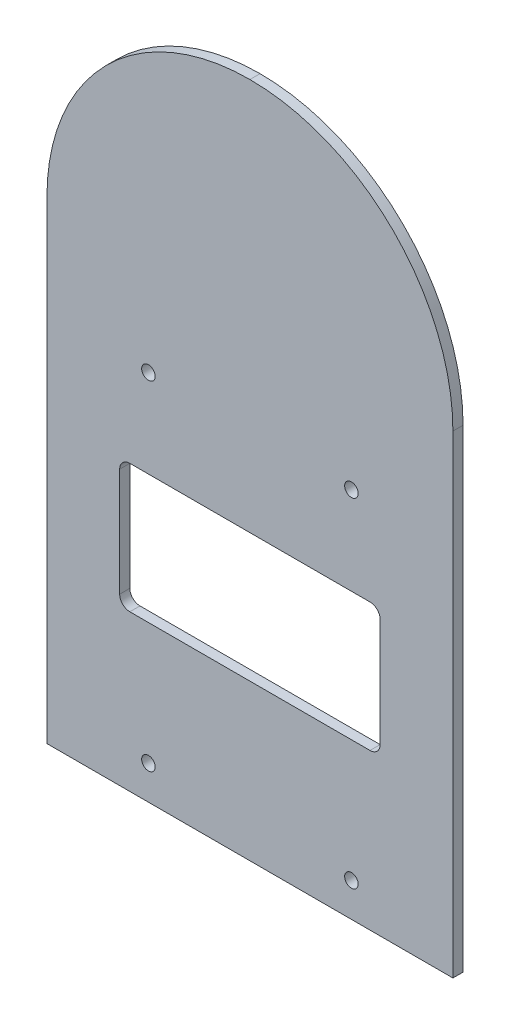
ISO-10303-21;
HEADER;
FILE_DESCRIPTION(('STEP AP214'),'2;1');
FILE_NAME('part.step','',(''),(''),'','','');
FILE_SCHEMA(('AUTOMOTIVE_DESIGN { 1 0 10303 214 1 1 1 1 }'));
ENDSEC;
DATA;
#1=APPLICATION_CONTEXT('core data for automotive mechanical design processes');
#2=APPLICATION_PROTOCOL_DEFINITION('international standard','automotive_design',2000,#1);
#3=PRODUCT_CONTEXT('',#1,'mechanical');
#4=PRODUCT('Part','Part','',(#3));
#5=PRODUCT_RELATED_PRODUCT_CATEGORY('part','',(#4));
#6=PRODUCT_DEFINITION_FORMATION('','',#4);
#7=PRODUCT_DEFINITION_CONTEXT('part definition',#1,'design');
#8=PRODUCT_DEFINITION('design','',#6,#7);
#9=PRODUCT_DEFINITION_SHAPE('','',#8);
#10=(LENGTH_UNIT() NAMED_UNIT(*) SI_UNIT(.MILLI.,.METRE.));
#11=(NAMED_UNIT(*) PLANE_ANGLE_UNIT() SI_UNIT($,.RADIAN.));
#12=(NAMED_UNIT(*) SI_UNIT($,.STERADIAN.) SOLID_ANGLE_UNIT());
#13=UNCERTAINTY_MEASURE_WITH_UNIT(LENGTH_MEASURE(1.E-05),#10,'distance_accuracy_value','');
#14=(GEOMETRIC_REPRESENTATION_CONTEXT(3) GLOBAL_UNCERTAINTY_ASSIGNED_CONTEXT((#13)) GLOBAL_UNIT_ASSIGNED_CONTEXT((#10,
#11,#12)) REPRESENTATION_CONTEXT('',''));
#15=CARTESIAN_POINT('',(0.,0.,0.));
#16=DIRECTION('',(0.,0.,1.));
#17=DIRECTION('',(1.,0.,0.));
#18=AXIS2_PLACEMENT_3D('',#15,#16,#17);
#19=CARTESIAN_POINT('',(-60.,-100.,3.));
#20=DIRECTION('',(1.,0.,0.));
#21=DIRECTION('',(0.,0.,-1.));
#22=AXIS2_PLACEMENT_3D('',#19,#20,#21);
#23=PLANE('',#22);
#24=DIRECTION('',(0.,-1.,0.));
#25=VECTOR('',#24,1.);
#26=CARTESIAN_POINT('',(-60.,-100.,3.));
#27=LINE('',#26,#25);
#28=CARTESIAN_POINT('',(-60.,40.,3.));
#29=VERTEX_POINT('',#28);
#30=CARTESIAN_POINT('',(-60.,-100.,3.));
#31=VERTEX_POINT('',#30);
#32=EDGE_CURVE('E202',#29,#31,#27,.T.);
#33=ORIENTED_EDGE('',*,*,#32,.F.);
#34=DIRECTION('',(0.,0.,-1.));
#35=VECTOR('',#34,1.);
#36=CARTESIAN_POINT('',(-60.,40.,3.));
#37=LINE('',#36,#35);
#38=CARTESIAN_POINT('',(-60.,40.,0.));
#39=VERTEX_POINT('',#38);
#40=EDGE_CURVE('E11',#29,#39,#37,.T.);
#41=ORIENTED_EDGE('',*,*,#40,.T.);
#42=DIRECTION('',(0.,-1.,0.));
#43=VECTOR('',#42,1.);
#44=CARTESIAN_POINT('',(-60.,-100.,0.));
#45=LINE('',#44,#43);
#46=CARTESIAN_POINT('',(-60.,-100.,0.));
#47=VERTEX_POINT('',#46);
#48=EDGE_CURVE('E211',#39,#47,#45,.T.);
#49=ORIENTED_EDGE('',*,*,#48,.T.);
#50=DIRECTION('',(0.,0.,-1.));
#51=VECTOR('',#50,1.);
#52=CARTESIAN_POINT('',(-60.,-100.,3.));
#53=LINE('',#52,#51);
#54=EDGE_CURVE('E219',#31,#47,#53,.T.);
#55=ORIENTED_EDGE('',*,*,#54,.F.);
#56=EDGE_LOOP('',(#33,#41,#49,#55));
#57=FACE_BOUND('',#56,.T.);
#58=ADVANCED_FACE('F34',(#57),#23,.F.);
#59=CARTESIAN_POINT('',(60.,-99.9999999999999,3.));
#60=DIRECTION('',(0.,1.,0.));
#61=DIRECTION('',(-1.,0.,0.));
#62=AXIS2_PLACEMENT_3D('',#59,#60,#61);
#63=PLANE('',#62);
#64=DIRECTION('',(1.,0.,0.));
#65=VECTOR('',#64,1.);
#66=CARTESIAN_POINT('',(60.,-99.9999999999999,0.));
#67=LINE('',#66,#65);
#68=CARTESIAN_POINT('',(60.,-99.9999999999999,0.));
#69=VERTEX_POINT('',#68);
#70=EDGE_CURVE('E213',#47,#69,#67,.T.);
#71=ORIENTED_EDGE('',*,*,#70,.T.);
#72=DIRECTION('',(0.,0.,-1.));
#73=VECTOR('',#72,1.);
#74=CARTESIAN_POINT('',(60.,-99.9999999999999,3.));
#75=LINE('',#74,#73);
#76=CARTESIAN_POINT('',(60.,-99.9999999999999,3.));
#77=VERTEX_POINT('',#76);
#78=EDGE_CURVE('E210',#77,#69,#75,.T.);
#79=ORIENTED_EDGE('',*,*,#78,.F.);
#80=DIRECTION('',(1.,0.,0.));
#81=VECTOR('',#80,1.);
#82=CARTESIAN_POINT('',(60.,-99.9999999999999,3.));
#83=LINE('',#82,#81);
#84=EDGE_CURVE('E204',#31,#77,#83,.T.);
#85=ORIENTED_EDGE('',*,*,#84,.F.);
#86=ORIENTED_EDGE('',*,*,#54,.T.);
#87=EDGE_LOOP('',(#71,#79,#85,#86));
#88=FACE_BOUND('',#87,.T.);
#89=ADVANCED_FACE('F261',(#88),#63,.F.);
#90=CARTESIAN_POINT('',(60.,-99.9999999999999,3.));
#91=DIRECTION('',(-1.,0.,0.));
#92=DIRECTION('',(0.,0.,1.));
#93=AXIS2_PLACEMENT_3D('',#90,#91,#92);
#94=PLANE('',#93);
#95=DIRECTION('',(0.,1.,0.));
#96=VECTOR('',#95,1.);
#97=CARTESIAN_POINT('',(60.,-99.9999999999999,0.));
#98=LINE('',#97,#96);
#99=CARTESIAN_POINT('',(60.,40.0000000000001,0.));
#100=VERTEX_POINT('',#99);
#101=EDGE_CURVE('E205',#69,#100,#98,.T.);
#102=ORIENTED_EDGE('',*,*,#101,.T.);
#103=DIRECTION('',(0.,0.,-1.));
#104=VECTOR('',#103,1.);
#105=CARTESIAN_POINT('',(60.,40.0000000000001,3.));
#106=LINE('',#105,#104);
#107=CARTESIAN_POINT('',(60.,40.0000000000001,3.));
#108=VERTEX_POINT('',#107);
#109=EDGE_CURVE('E226',#100,#108,#106,.F.);
#110=ORIENTED_EDGE('',*,*,#109,.T.);
#111=DIRECTION('',(0.,1.,0.));
#112=VECTOR('',#111,1.);
#113=CARTESIAN_POINT('',(60.,-99.9999999999999,3.));
#114=LINE('',#113,#112);
#115=EDGE_CURVE('E207',#77,#108,#114,.T.);
#116=ORIENTED_EDGE('',*,*,#115,.F.);
#117=ORIENTED_EDGE('',*,*,#78,.T.);
#118=EDGE_LOOP('',(#102,#110,#116,#117));
#119=FACE_BOUND('',#118,.T.);
#120=ADVANCED_FACE('F267',(#119),#94,.F.);
#121=CARTESIAN_POINT('',(0.,0.,3.));
#122=DIRECTION('',(0.,0.,1.));
#123=DIRECTION('',(1.,0.,0.));
#124=AXIS2_PLACEMENT_3D('',#121,#122,#123);
#125=PLANE('',#124);
#126=CARTESIAN_POINT('',(30.,-90.,3.));
#127=DIRECTION('',(0.,0.,1.));
#128=DIRECTION('',(-1.,0.,0.));
#129=AXIS2_PLACEMENT_3D('',#126,#127,#128);
#130=CIRCLE('',#129,2.);
#131=CARTESIAN_POINT('',(28.,-90.,3.));
#132=VERTEX_POINT('',#131);
#133=EDGE_CURVE('E373',#132,#132,#130,.T.);
#134=ORIENTED_EDGE('',*,*,#133,.F.);
#135=EDGE_LOOP('',(#134));
#136=FACE_BOUND('',#135,.T.);
#137=CARTESIAN_POINT('',(30.,10.,3.));
#138=DIRECTION('',(0.,0.,1.));
#139=DIRECTION('',(-1.,0.,0.));
#140=AXIS2_PLACEMENT_3D('',#137,#138,#139);
#141=CIRCLE('',#140,2.);
#142=CARTESIAN_POINT('',(28.,10.,3.));
#143=VERTEX_POINT('',#142);
#144=EDGE_CURVE('E369',#143,#143,#141,.T.);
#145=ORIENTED_EDGE('',*,*,#144,.F.);
#146=EDGE_LOOP('',(#145));
#147=FACE_BOUND('',#146,.T.);
#148=CARTESIAN_POINT('',(-30.,10.,3.));
#149=DIRECTION('',(0.,0.,1.));
#150=DIRECTION('',(1.,0.,0.));
#151=AXIS2_PLACEMENT_3D('',#148,#149,#150);
#152=CIRCLE('',#151,2.);
#153=CARTESIAN_POINT('',(-28.,10.,3.));
#154=VERTEX_POINT('',#153);
#155=EDGE_CURVE('E362',#154,#154,#152,.T.);
#156=ORIENTED_EDGE('',*,*,#155,.F.);
#157=EDGE_LOOP('',(#156));
#158=FACE_BOUND('',#157,.T.);
#159=CARTESIAN_POINT('',(-30.,-90.,3.));
#160=DIRECTION('',(0.,0.,1.));
#161=DIRECTION('',(1.,0.,0.));
#162=AXIS2_PLACEMENT_3D('',#159,#160,#161);
#163=CIRCLE('',#162,2.);
#164=CARTESIAN_POINT('',(-28.,-90.,3.));
#165=VERTEX_POINT('',#164);
#166=EDGE_CURVE('E155',#165,#165,#163,.T.);
#167=ORIENTED_EDGE('',*,*,#166,.F.);
#168=EDGE_LOOP('',(#167));
#169=FACE_BOUND('',#168,.T.);
#170=CARTESIAN_POINT('',(-35.4999999999946,-51.0000000000016,3.));
#171=DIRECTION('',(0.,0.,1.));
#172=DIRECTION('',(1.,0.,0.));
#173=AXIS2_PLACEMENT_3D('',#170,#171,#172);
#174=CIRCLE('',#173,3.00000000000001);
#175=CARTESIAN_POINT('',(-38.4999999999946,-51.0000000000016,3.));
#176=VERTEX_POINT('',#175);
#177=CARTESIAN_POINT('',(-35.4999999999946,-54.0000000000016,3.));
#178=VERTEX_POINT('',#177);
#179=EDGE_CURVE('E51',#176,#178,#174,.T.);
#180=ORIENTED_EDGE('',*,*,#179,.F.);
#181=DIRECTION('',(0.,-1.,0.));
#182=VECTOR('',#181,1.);
#183=CARTESIAN_POINT('',(-38.4999999999946,-19.0000000000016,3.));
#184=LINE('',#183,#182);
#185=CARTESIAN_POINT('',(-38.4999999999946,-19.0000000000016,3.));
#186=VERTEX_POINT('',#185);
#187=EDGE_CURVE('E149',#186,#176,#184,.T.);
#188=ORIENTED_EDGE('',*,*,#187,.F.);
#189=CARTESIAN_POINT('',(-35.4999999999946,-19.0000000000016,3.));
#190=DIRECTION('',(0.,0.,1.));
#191=DIRECTION('',(-1.,0.,0.));
#192=AXIS2_PLACEMENT_3D('',#189,#190,#191);
#193=CIRCLE('',#192,3.);
#194=CARTESIAN_POINT('',(-35.4999999999946,-16.0000000000016,3.));
#195=VERTEX_POINT('',#194);
#196=EDGE_CURVE('E152',#195,#186,#193,.T.);
#197=ORIENTED_EDGE('',*,*,#196,.F.);
#198=DIRECTION('',(-1.,0.,0.));
#199=VECTOR('',#198,1.);
#200=CARTESIAN_POINT('',(-35.4999999999946,-16.0000000000016,3.));
#201=LINE('',#200,#199);
#202=CARTESIAN_POINT('',(35.5000000000054,-16.0000000000016,3.));
#203=VERTEX_POINT('',#202);
#204=EDGE_CURVE('E183',#203,#195,#201,.T.);
#205=ORIENTED_EDGE('',*,*,#204,.F.);
#206=CARTESIAN_POINT('',(35.5000000000054,-19.0000000000016,3.));
#207=DIRECTION('',(0.,0.,1.));
#208=DIRECTION('',(1.,0.,0.));
#209=AXIS2_PLACEMENT_3D('',#206,#207,#208);
#210=CIRCLE('',#209,3.);
#211=CARTESIAN_POINT('',(38.5000000000054,-19.0000000000016,3.));
#212=VERTEX_POINT('',#211);
#213=EDGE_CURVE('E180',#212,#203,#210,.T.);
#214=ORIENTED_EDGE('',*,*,#213,.F.);
#215=DIRECTION('',(0.,1.,0.));
#216=VECTOR('',#215,1.);
#217=CARTESIAN_POINT('',(38.5000000000054,-19.0000000000016,3.));
#218=LINE('',#217,#216);
#219=CARTESIAN_POINT('',(38.5000000000054,-51.0000000000016,3.));
#220=VERTEX_POINT('',#219);
#221=EDGE_CURVE('E177',#220,#212,#218,.T.);
#222=ORIENTED_EDGE('',*,*,#221,.F.);
#223=CARTESIAN_POINT('',(35.5000000000054,-51.0000000000016,3.));
#224=DIRECTION('',(0.,0.,1.));
#225=DIRECTION('',(1.,0.,0.));
#226=AXIS2_PLACEMENT_3D('',#223,#224,#225);
#227=CIRCLE('',#226,3.);
#228=CARTESIAN_POINT('',(35.5000000000054,-54.0000000000016,3.));
#229=VERTEX_POINT('',#228);
#230=EDGE_CURVE('E174',#229,#220,#227,.T.);
#231=ORIENTED_EDGE('',*,*,#230,.F.);
#232=DIRECTION('',(1.,0.,0.));
#233=VECTOR('',#232,1.);
#234=CARTESIAN_POINT('',(-35.4999999999946,-54.0000000000016,3.));
#235=LINE('',#234,#233);
#236=EDGE_CURVE('E172',#178,#229,#235,.T.);
#237=ORIENTED_EDGE('',*,*,#236,.F.);
#238=EDGE_LOOP('',(#180,#188,#197,#205,#214,#222,#231,#237));
#239=FACE_BOUND('',#238,.T.);
#240=ORIENTED_EDGE('',*,*,#115,.T.);
#241=CARTESIAN_POINT('',(0.,40.0000000000001,3.));
#242=DIRECTION('',(0.,0.,1.));
#243=DIRECTION('',(1.,0.,0.));
#244=AXIS2_PLACEMENT_3D('',#241,#242,#243);
#245=CIRCLE('',#244,60.);
#246=CARTESIAN_POINT('',(0.,100.,3.));
#247=VERTEX_POINT('',#246);
#248=EDGE_CURVE('E43',#108,#247,#245,.T.);
#249=ORIENTED_EDGE('',*,*,#248,.T.);
#250=CARTESIAN_POINT('',(0.,40.,3.));
#251=DIRECTION('',(0.,0.,1.));
#252=DIRECTION('',(1.,0.,0.));
#253=AXIS2_PLACEMENT_3D('',#250,#251,#252);
#254=CIRCLE('',#253,60.);
#255=EDGE_CURVE('E229',#247,#29,#254,.T.);
#256=ORIENTED_EDGE('',*,*,#255,.T.);
#257=ORIENTED_EDGE('',*,*,#32,.T.);
#258=ORIENTED_EDGE('',*,*,#84,.T.);
#259=EDGE_LOOP('',(#240,#249,#256,#257,#258));
#260=FACE_BOUND('',#259,.T.);
#261=ADVANCED_FACE('F290',(#136,#147,#158,#169,#239,#260),#125,.T.);
#262=CARTESIAN_POINT('',(0.,0.,0.));
#263=DIRECTION('',(0.,0.,1.));
#264=DIRECTION('',(1.,0.,0.));
#265=AXIS2_PLACEMENT_3D('',#262,#263,#264);
#266=PLANE('',#265);
#267=CARTESIAN_POINT('',(30.,-90.,0.));
#268=DIRECTION('',(0.,0.,1.));
#269=DIRECTION('',(1.,0.,0.));
#270=AXIS2_PLACEMENT_3D('',#267,#268,#269);
#271=CIRCLE('',#270,2.);
#272=CARTESIAN_POINT('',(32.,-90.,0.));
#273=VERTEX_POINT('',#272);
#274=EDGE_CURVE('E38',#273,#273,#271,.T.);
#275=ORIENTED_EDGE('',*,*,#274,.T.);
#276=EDGE_LOOP('',(#275));
#277=FACE_BOUND('',#276,.T.);
#278=CARTESIAN_POINT('',(30.,10.,0.));
#279=DIRECTION('',(0.,0.,1.));
#280=DIRECTION('',(1.,0.,0.));
#281=AXIS2_PLACEMENT_3D('',#278,#279,#280);
#282=CIRCLE('',#281,2.);
#283=CARTESIAN_POINT('',(32.,10.,0.));
#284=VERTEX_POINT('',#283);
#285=EDGE_CURVE('E239',#284,#284,#282,.T.);
#286=ORIENTED_EDGE('',*,*,#285,.T.);
#287=EDGE_LOOP('',(#286));
#288=FACE_BOUND('',#287,.T.);
#289=CARTESIAN_POINT('',(-30.,10.,0.));
#290=DIRECTION('',(0.,0.,1.));
#291=DIRECTION('',(1.,0.,0.));
#292=AXIS2_PLACEMENT_3D('',#289,#290,#291);
#293=CIRCLE('',#292,2.);
#294=CARTESIAN_POINT('',(-28.,10.,0.));
#295=VERTEX_POINT('',#294);
#296=EDGE_CURVE('E237',#295,#295,#293,.T.);
#297=ORIENTED_EDGE('',*,*,#296,.T.);
#298=EDGE_LOOP('',(#297));
#299=FACE_BOUND('',#298,.T.);
#300=CARTESIAN_POINT('',(-30.,-90.,0.));
#301=DIRECTION('',(0.,0.,1.));
#302=DIRECTION('',(1.,0.,0.));
#303=AXIS2_PLACEMENT_3D('',#300,#301,#302);
#304=CIRCLE('',#303,2.);
#305=CARTESIAN_POINT('',(-28.,-90.,0.));
#306=VERTEX_POINT('',#305);
#307=EDGE_CURVE('E234',#306,#306,#304,.T.);
#308=ORIENTED_EDGE('',*,*,#307,.T.);
#309=EDGE_LOOP('',(#308));
#310=FACE_BOUND('',#309,.T.);
#311=DIRECTION('',(0.,-1.,0.));
#312=VECTOR('',#311,1.);
#313=CARTESIAN_POINT('',(-38.4999999999946,-19.0000000000016,0.));
#314=LINE('',#313,#312);
#315=CARTESIAN_POINT('',(-38.4999999999946,-19.0000000000016,0.));
#316=VERTEX_POINT('',#315);
#317=CARTESIAN_POINT('',(-38.4999999999946,-51.0000000000016,0.));
#318=VERTEX_POINT('',#317);
#319=EDGE_CURVE('E138',#316,#318,#314,.T.);
#320=ORIENTED_EDGE('',*,*,#319,.T.);
#321=CARTESIAN_POINT('',(-35.4999999999946,-51.0000000000016,0.));
#322=DIRECTION('',(0.,0.,1.));
#323=DIRECTION('',(1.,0.,0.));
#324=AXIS2_PLACEMENT_3D('',#321,#322,#323);
#325=CIRCLE('',#324,3.00000000000001);
#326=CARTESIAN_POINT('',(-35.4999999999946,-54.0000000000016,0.));
#327=VERTEX_POINT('',#326);
#328=EDGE_CURVE('E132',#318,#327,#325,.T.);
#329=ORIENTED_EDGE('',*,*,#328,.T.);
#330=DIRECTION('',(1.,0.,0.));
#331=VECTOR('',#330,1.);
#332=CARTESIAN_POINT('',(-35.4999999999946,-54.0000000000016,0.));
#333=LINE('',#332,#331);
#334=CARTESIAN_POINT('',(35.5000000000054,-54.0000000000016,0.));
#335=VERTEX_POINT('',#334);
#336=EDGE_CURVE('E141',#327,#335,#333,.T.);
#337=ORIENTED_EDGE('',*,*,#336,.T.);
#338=CARTESIAN_POINT('',(35.5000000000054,-51.0000000000016,0.));
#339=DIRECTION('',(0.,0.,1.));
#340=DIRECTION('',(1.,0.,0.));
#341=AXIS2_PLACEMENT_3D('',#338,#339,#340);
#342=CIRCLE('',#341,3.);
#343=CARTESIAN_POINT('',(38.5000000000054,-51.0000000000016,0.));
#344=VERTEX_POINT('',#343);
#345=EDGE_CURVE('E59',#335,#344,#342,.T.);
#346=ORIENTED_EDGE('',*,*,#345,.T.);
#347=DIRECTION('',(0.,1.,0.));
#348=VECTOR('',#347,1.);
#349=CARTESIAN_POINT('',(38.5000000000054,-19.0000000000016,0.));
#350=LINE('',#349,#348);
#351=CARTESIAN_POINT('',(38.5000000000054,-19.0000000000016,0.));
#352=VERTEX_POINT('',#351);
#353=EDGE_CURVE('E159',#344,#352,#350,.T.);
#354=ORIENTED_EDGE('',*,*,#353,.T.);
#355=CARTESIAN_POINT('',(35.5000000000054,-19.0000000000016,0.));
#356=DIRECTION('',(0.,0.,1.));
#357=DIRECTION('',(1.,0.,0.));
#358=AXIS2_PLACEMENT_3D('',#355,#356,#357);
#359=CIRCLE('',#358,3.);
#360=CARTESIAN_POINT('',(35.5000000000054,-16.0000000000016,0.));
#361=VERTEX_POINT('',#360);
#362=EDGE_CURVE('E162',#352,#361,#359,.T.);
#363=ORIENTED_EDGE('',*,*,#362,.T.);
#364=DIRECTION('',(-1.,0.,0.));
#365=VECTOR('',#364,1.);
#366=CARTESIAN_POINT('',(-35.4999999999946,-16.0000000000016,0.));
#367=LINE('',#366,#365);
#368=CARTESIAN_POINT('',(-35.4999999999946,-16.0000000000016,0.));
#369=VERTEX_POINT('',#368);
#370=EDGE_CURVE('E165',#361,#369,#367,.T.);
#371=ORIENTED_EDGE('',*,*,#370,.T.);
#372=CARTESIAN_POINT('',(-35.4999999999946,-19.0000000000016,0.));
#373=DIRECTION('',(0.,0.,1.));
#374=DIRECTION('',(-1.,0.,0.));
#375=AXIS2_PLACEMENT_3D('',#372,#373,#374);
#376=CIRCLE('',#375,3.);
#377=EDGE_CURVE('E168',#369,#316,#376,.T.);
#378=ORIENTED_EDGE('',*,*,#377,.T.);
#379=EDGE_LOOP('',(#320,#329,#337,#346,#354,#363,#371,#378));
#380=FACE_BOUND('',#379,.T.);
#381=CARTESIAN_POINT('',(0.,40.,0.));
#382=DIRECTION('',(0.,0.,1.));
#383=DIRECTION('',(1.,0.,0.));
#384=AXIS2_PLACEMENT_3D('',#381,#382,#383);
#385=CIRCLE('',#384,60.);
#386=CARTESIAN_POINT('',(0.,100.,0.));
#387=VERTEX_POINT('',#386);
#388=EDGE_CURVE('E222',#39,#387,#385,.F.);
#389=ORIENTED_EDGE('',*,*,#388,.T.);
#390=CARTESIAN_POINT('',(0.,40.0000000000001,0.));
#391=DIRECTION('',(0.,0.,1.));
#392=DIRECTION('',(1.,0.,0.));
#393=AXIS2_PLACEMENT_3D('',#390,#391,#392);
#394=CIRCLE('',#393,60.);
#395=EDGE_CURVE('E224',#387,#100,#394,.F.);
#396=ORIENTED_EDGE('',*,*,#395,.T.);
#397=ORIENTED_EDGE('',*,*,#101,.F.);
#398=ORIENTED_EDGE('',*,*,#70,.F.);
#399=ORIENTED_EDGE('',*,*,#48,.F.);
#400=EDGE_LOOP('',(#389,#396,#397,#398,#399));
#401=FACE_BOUND('',#400,.T.);
#402=ADVANCED_FACE('F145',(#277,#288,#299,#310,#380,#401),#266,.F.);
#403=CARTESIAN_POINT('',(0.,40.,3.));
#404=DIRECTION('',(0.,0.,-1.));
#405=DIRECTION('',(-1.,0.,0.));
#406=AXIS2_PLACEMENT_3D('',#403,#404,#405);
#407=CYLINDRICAL_SURFACE('',#406,60.);
#408=ORIENTED_EDGE('',*,*,#40,.F.);
#409=ORIENTED_EDGE('',*,*,#255,.F.);
#410=DIRECTION('',(0.,0.,-1.));
#411=VECTOR('',#410,1.);
#412=CARTESIAN_POINT('',(0.,100.,3.));
#413=LINE('',#412,#411);
#414=EDGE_CURVE('E190',#387,#247,#413,.F.);
#415=ORIENTED_EDGE('',*,*,#414,.F.);
#416=ORIENTED_EDGE('',*,*,#388,.F.);
#417=EDGE_LOOP('',(#408,#409,#415,#416));
#418=FACE_BOUND('',#417,.T.);
#419=ADVANCED_FACE('F36',(#418),#407,.T.);
#420=CARTESIAN_POINT('',(0.,40.0000000000001,3.));
#421=DIRECTION('',(0.,0.,-1.));
#422=DIRECTION('',(-1.,0.,0.));
#423=AXIS2_PLACEMENT_3D('',#420,#421,#422);
#424=CYLINDRICAL_SURFACE('',#423,60.);
#425=ORIENTED_EDGE('',*,*,#248,.F.);
#426=ORIENTED_EDGE('',*,*,#109,.F.);
#427=ORIENTED_EDGE('',*,*,#395,.F.);
#428=ORIENTED_EDGE('',*,*,#414,.T.);
#429=EDGE_LOOP('',(#425,#426,#427,#428));
#430=FACE_BOUND('',#429,.T.);
#431=ADVANCED_FACE('F272',(#430),#424,.T.);
#432=CARTESIAN_POINT('',(-35.4999999999946,-51.0000000000016,0.));
#433=DIRECTION('',(0.,0.,1.));
#434=DIRECTION('',(1.,0.,0.));
#435=AXIS2_PLACEMENT_3D('',#432,#433,#434);
#436=CYLINDRICAL_SURFACE('',#435,3.00000000000001);
#437=ORIENTED_EDGE('',*,*,#179,.T.);
#438=DIRECTION('',(0.,0.,1.));
#439=VECTOR('',#438,1.);
#440=CARTESIAN_POINT('',(-35.4999999999946,-54.0000000000016,0.));
#441=LINE('',#440,#439);
#442=EDGE_CURVE('E128',#327,#178,#441,.T.);
#443=ORIENTED_EDGE('',*,*,#442,.F.);
#444=ORIENTED_EDGE('',*,*,#328,.F.);
#445=DIRECTION('',(0.,0.,1.));
#446=VECTOR('',#445,1.);
#447=CARTESIAN_POINT('',(-38.4999999999946,-51.0000000000016,0.));
#448=LINE('',#447,#446);
#449=EDGE_CURVE('E188',#318,#176,#448,.T.);
#450=ORIENTED_EDGE('',*,*,#449,.T.);
#451=EDGE_LOOP('',(#437,#443,#444,#450));
#452=FACE_BOUND('',#451,.T.);
#453=ADVANCED_FACE('F130',(#452),#436,.F.);
#454=CARTESIAN_POINT('',(-38.4999999999946,-19.0000000000016,0.));
#455=DIRECTION('',(-1.,0.,0.));
#456=DIRECTION('',(0.,0.,1.));
#457=AXIS2_PLACEMENT_3D('',#454,#455,#456);
#458=PLANE('',#457);
#459=ORIENTED_EDGE('',*,*,#187,.T.);
#460=ORIENTED_EDGE('',*,*,#449,.F.);
#461=ORIENTED_EDGE('',*,*,#319,.F.);
#462=DIRECTION('',(0.,0.,1.));
#463=VECTOR('',#462,1.);
#464=CARTESIAN_POINT('',(-38.4999999999946,-19.0000000000016,0.));
#465=LINE('',#464,#463);
#466=EDGE_CURVE('E191',#316,#186,#465,.T.);
#467=ORIENTED_EDGE('',*,*,#466,.T.);
#468=EDGE_LOOP('',(#459,#460,#461,#467));
#469=FACE_BOUND('',#468,.T.);
#470=ADVANCED_FACE('F279',(#469),#458,.F.);
#471=CARTESIAN_POINT('',(-35.4999999999946,-19.0000000000016,0.));
#472=DIRECTION('',(0.,0.,1.));
#473=DIRECTION('',(1.,0.,0.));
#474=AXIS2_PLACEMENT_3D('',#471,#472,#473);
#475=CYLINDRICAL_SURFACE('',#474,3.);
#476=ORIENTED_EDGE('',*,*,#196,.T.);
#477=ORIENTED_EDGE('',*,*,#466,.F.);
#478=ORIENTED_EDGE('',*,*,#377,.F.);
#479=DIRECTION('',(0.,0.,1.));
#480=VECTOR('',#479,1.);
#481=CARTESIAN_POINT('',(-35.4999999999946,-16.0000000000016,0.));
#482=LINE('',#481,#480);
#483=EDGE_CURVE('E193',#369,#195,#482,.T.);
#484=ORIENTED_EDGE('',*,*,#483,.T.);
#485=EDGE_LOOP('',(#476,#477,#478,#484));
#486=FACE_BOUND('',#485,.T.);
#487=ADVANCED_FACE('F399',(#486),#475,.F.);
#488=CARTESIAN_POINT('',(-35.4999999999946,-16.0000000000016,0.));
#489=DIRECTION('',(0.,1.,0.));
#490=DIRECTION('',(0.,0.,1.));
#491=AXIS2_PLACEMENT_3D('',#488,#489,#490);
#492=PLANE('',#491);
#493=ORIENTED_EDGE('',*,*,#204,.T.);
#494=ORIENTED_EDGE('',*,*,#483,.F.);
#495=ORIENTED_EDGE('',*,*,#370,.F.);
#496=DIRECTION('',(0.,0.,1.));
#497=VECTOR('',#496,1.);
#498=CARTESIAN_POINT('',(35.5000000000054,-16.0000000000016,0.));
#499=LINE('',#498,#497);
#500=EDGE_CURVE('E195',#361,#203,#499,.T.);
#501=ORIENTED_EDGE('',*,*,#500,.T.);
#502=EDGE_LOOP('',(#493,#494,#495,#501));
#503=FACE_BOUND('',#502,.T.);
#504=ADVANCED_FACE('F396',(#503),#492,.F.);
#505=CARTESIAN_POINT('',(35.5000000000054,-19.0000000000016,0.));
#506=DIRECTION('',(0.,0.,1.));
#507=DIRECTION('',(1.,0.,0.));
#508=AXIS2_PLACEMENT_3D('',#505,#506,#507);
#509=CYLINDRICAL_SURFACE('',#508,3.);
#510=ORIENTED_EDGE('',*,*,#213,.T.);
#511=ORIENTED_EDGE('',*,*,#500,.F.);
#512=ORIENTED_EDGE('',*,*,#362,.F.);
#513=DIRECTION('',(0.,0.,1.));
#514=VECTOR('',#513,1.);
#515=CARTESIAN_POINT('',(38.5000000000054,-19.0000000000016,0.));
#516=LINE('',#515,#514);
#517=EDGE_CURVE('E197',#352,#212,#516,.T.);
#518=ORIENTED_EDGE('',*,*,#517,.T.);
#519=EDGE_LOOP('',(#510,#511,#512,#518));
#520=FACE_BOUND('',#519,.T.);
#521=ADVANCED_FACE('F393',(#520),#509,.F.);
#522=CARTESIAN_POINT('',(38.5000000000054,-19.0000000000016,0.));
#523=DIRECTION('',(1.,0.,0.));
#524=DIRECTION('',(0.,1.,0.));
#525=AXIS2_PLACEMENT_3D('',#522,#523,#524);
#526=PLANE('',#525);
#527=ORIENTED_EDGE('',*,*,#221,.T.);
#528=ORIENTED_EDGE('',*,*,#517,.F.);
#529=ORIENTED_EDGE('',*,*,#353,.F.);
#530=DIRECTION('',(0.,0.,1.));
#531=VECTOR('',#530,1.);
#532=CARTESIAN_POINT('',(38.5000000000054,-51.0000000000016,0.));
#533=LINE('',#532,#531);
#534=EDGE_CURVE('E199',#344,#220,#533,.T.);
#535=ORIENTED_EDGE('',*,*,#534,.T.);
#536=EDGE_LOOP('',(#527,#528,#529,#535));
#537=FACE_BOUND('',#536,.T.);
#538=ADVANCED_FACE('F389',(#537),#526,.F.);
#539=CARTESIAN_POINT('',(35.5000000000054,-51.0000000000016,0.));
#540=DIRECTION('',(0.,0.,1.));
#541=DIRECTION('',(1.,0.,0.));
#542=AXIS2_PLACEMENT_3D('',#539,#540,#541);
#543=CYLINDRICAL_SURFACE('',#542,3.);
#544=ORIENTED_EDGE('',*,*,#230,.T.);
#545=ORIENTED_EDGE('',*,*,#534,.F.);
#546=ORIENTED_EDGE('',*,*,#345,.F.);
#547=DIRECTION('',(0.,0.,1.));
#548=VECTOR('',#547,1.);
#549=CARTESIAN_POINT('',(35.5000000000054,-54.0000000000016,0.));
#550=LINE('',#549,#548);
#551=EDGE_CURVE('E137',#335,#229,#550,.T.);
#552=ORIENTED_EDGE('',*,*,#551,.T.);
#553=EDGE_LOOP('',(#544,#545,#546,#552));
#554=FACE_BOUND('',#553,.T.);
#555=ADVANCED_FACE('F386',(#554),#543,.F.);
#556=CARTESIAN_POINT('',(-35.4999999999946,-54.0000000000016,0.));
#557=DIRECTION('',(0.,-1.,0.));
#558=DIRECTION('',(0.,0.,-1.));
#559=AXIS2_PLACEMENT_3D('',#556,#557,#558);
#560=PLANE('',#559);
#561=ORIENTED_EDGE('',*,*,#236,.T.);
#562=ORIENTED_EDGE('',*,*,#551,.F.);
#563=ORIENTED_EDGE('',*,*,#336,.F.);
#564=ORIENTED_EDGE('',*,*,#442,.T.);
#565=EDGE_LOOP('',(#561,#562,#563,#564));
#566=FACE_BOUND('',#565,.T.);
#567=ADVANCED_FACE('F142',(#566),#560,.F.);
#568=CARTESIAN_POINT('',(-30.,-90.,-7.));
#569=DIRECTION('',(0.,0.,1.));
#570=DIRECTION('',(1.,0.,0.));
#571=AXIS2_PLACEMENT_3D('',#568,#569,#570);
#572=CYLINDRICAL_SURFACE('',#571,2.);
#573=ORIENTED_EDGE('',*,*,#166,.T.);
#574=EDGE_LOOP('',(#573));
#575=FACE_BOUND('',#574,.T.);
#576=ORIENTED_EDGE('',*,*,#307,.F.);
#577=EDGE_LOOP('',(#576));
#578=FACE_BOUND('',#577,.T.);
#579=ADVANCED_FACE('F332',(#575,#578),#572,.F.);
#580=CARTESIAN_POINT('',(-30.,10.,-7.));
#581=DIRECTION('',(0.,0.,1.));
#582=DIRECTION('',(1.,0.,0.));
#583=AXIS2_PLACEMENT_3D('',#580,#581,#582);
#584=CYLINDRICAL_SURFACE('',#583,2.);
#585=ORIENTED_EDGE('',*,*,#155,.T.);
#586=EDGE_LOOP('',(#585));
#587=FACE_BOUND('',#586,.T.);
#588=ORIENTED_EDGE('',*,*,#296,.F.);
#589=EDGE_LOOP('',(#588));
#590=FACE_BOUND('',#589,.T.);
#591=ADVANCED_FACE('F255',(#587,#590),#584,.F.);
#592=CARTESIAN_POINT('',(30.,10.,-7.));
#593=DIRECTION('',(0.,0.,1.));
#594=DIRECTION('',(1.,0.,0.));
#595=AXIS2_PLACEMENT_3D('',#592,#593,#594);
#596=CYLINDRICAL_SURFACE('',#595,2.);
#597=ORIENTED_EDGE('',*,*,#144,.T.);
#598=EDGE_LOOP('',(#597));
#599=FACE_BOUND('',#598,.T.);
#600=ORIENTED_EDGE('',*,*,#285,.F.);
#601=EDGE_LOOP('',(#600));
#602=FACE_BOUND('',#601,.T.);
#603=ADVANCED_FACE('F249',(#599,#602),#596,.F.);
#604=CARTESIAN_POINT('',(30.,-90.,-7.));
#605=DIRECTION('',(0.,0.,1.));
#606=DIRECTION('',(1.,0.,0.));
#607=AXIS2_PLACEMENT_3D('',#604,#605,#606);
#608=CYLINDRICAL_SURFACE('',#607,2.);
#609=ORIENTED_EDGE('',*,*,#133,.T.);
#610=EDGE_LOOP('',(#609));
#611=FACE_BOUND('',#610,.T.);
#612=ORIENTED_EDGE('',*,*,#274,.F.);
#613=EDGE_LOOP('',(#612));
#614=FACE_BOUND('',#613,.T.);
#615=ADVANCED_FACE('F247',(#611,#614),#608,.F.);
#616=CLOSED_SHELL('',(#58,#89,#120,#261,#402,#419,#431,#453,#470,#487,#504,#521,#538,#555,#567,
#579,#591,#603,#615));
#617=MANIFOLD_SOLID_BREP('B2',#616);
#618=ADVANCED_BREP_SHAPE_REPRESENTATION('',(#18,#617),#14);
#619=SHAPE_DEFINITION_REPRESENTATION(#9,#618);
ENDSEC;
END-ISO-10303-21;
